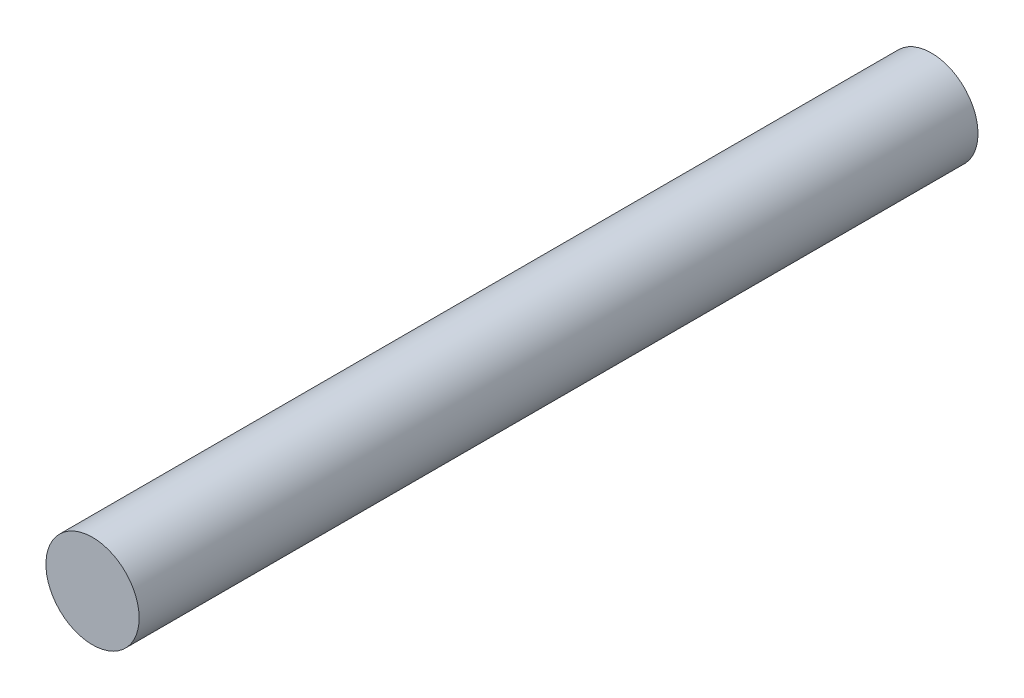
ISO-10303-21;
HEADER;
FILE_DESCRIPTION(('STEP AP214'),'2;1');
FILE_NAME('part.step','',(''),(''),'','','');
FILE_SCHEMA(('AUTOMOTIVE_DESIGN { 1 0 10303 214 1 1 1 1 }'));
ENDSEC;
DATA;
#1=APPLICATION_CONTEXT('core data for automotive mechanical design processes');
#2=APPLICATION_PROTOCOL_DEFINITION('international standard','automotive_design',2000,#1);
#3=PRODUCT_CONTEXT('',#1,'mechanical');
#4=PRODUCT('Part','Part','',(#3));
#5=PRODUCT_RELATED_PRODUCT_CATEGORY('part','',(#4));
#6=PRODUCT_DEFINITION_FORMATION('','',#4);
#7=PRODUCT_DEFINITION_CONTEXT('part definition',#1,'design');
#8=PRODUCT_DEFINITION('design','',#6,#7);
#9=PRODUCT_DEFINITION_SHAPE('','',#8);
#10=(LENGTH_UNIT() NAMED_UNIT(*) SI_UNIT(.MILLI.,.METRE.));
#11=(NAMED_UNIT(*) PLANE_ANGLE_UNIT() SI_UNIT($,.RADIAN.));
#12=(NAMED_UNIT(*) SI_UNIT($,.STERADIAN.) SOLID_ANGLE_UNIT());
#13=UNCERTAINTY_MEASURE_WITH_UNIT(LENGTH_MEASURE(1.E-05),#10,'distance_accuracy_value','');
#14=(GEOMETRIC_REPRESENTATION_CONTEXT(3) GLOBAL_UNCERTAINTY_ASSIGNED_CONTEXT((#13)) GLOBAL_UNIT_ASSIGNED_CONTEXT((#10,
#11,#12)) REPRESENTATION_CONTEXT('',''));
#15=CARTESIAN_POINT('',(0.,0.,0.));
#16=DIRECTION('',(0.,0.,1.));
#17=DIRECTION('',(1.,0.,0.));
#18=AXIS2_PLACEMENT_3D('',#15,#16,#17);
#19=CARTESIAN_POINT('',(0.,0.,53.1));
#20=DIRECTION('',(0.,0.,-1.));
#21=DIRECTION('',(-1.,0.,0.));
#22=AXIS2_PLACEMENT_3D('',#19,#20,#21);
#23=CYLINDRICAL_SURFACE('',#22,2.95);
#24=CARTESIAN_POINT('',(0.,0.,53.1));
#25=DIRECTION('',(0.,0.,1.));
#26=DIRECTION('',(1.,0.,0.));
#27=AXIS2_PLACEMENT_3D('',#24,#25,#26);
#28=CIRCLE('',#27,2.95);
#29=CARTESIAN_POINT('',(2.95,0.,53.1));
#30=VERTEX_POINT('',#29);
#31=EDGE_CURVE('E10',#30,#30,#28,.T.);
#32=ORIENTED_EDGE('',*,*,#31,.F.);
#33=EDGE_LOOP('',(#32));
#34=FACE_BOUND('',#33,.T.);
#35=CARTESIAN_POINT('',(0.,0.,0.));
#36=DIRECTION('',(0.,0.,1.));
#37=DIRECTION('',(1.,0.,0.));
#38=AXIS2_PLACEMENT_3D('',#35,#36,#37);
#39=CIRCLE('',#38,2.95);
#40=CARTESIAN_POINT('',(2.95,0.,0.));
#41=VERTEX_POINT('',#40);
#42=EDGE_CURVE('E33',#41,#41,#39,.T.);
#43=ORIENTED_EDGE('',*,*,#42,.T.);
#44=EDGE_LOOP('',(#43));
#45=FACE_BOUND('',#44,.T.);
#46=ADVANCED_FACE('F30',(#34,#45),#23,.T.);
#47=CARTESIAN_POINT('',(0.,0.,53.1));
#48=DIRECTION('',(0.,0.,1.));
#49=DIRECTION('',(1.,0.,0.));
#50=AXIS2_PLACEMENT_3D('',#47,#48,#49);
#51=PLANE('',#50);
#52=ORIENTED_EDGE('',*,*,#31,.T.);
#53=EDGE_LOOP('',(#52));
#54=FACE_BOUND('',#53,.T.);
#55=ADVANCED_FACE('F45',(#54),#51,.T.);
#56=CARTESIAN_POINT('',(0.,0.,0.));
#57=DIRECTION('',(0.,0.,1.));
#58=DIRECTION('',(1.,0.,0.));
#59=AXIS2_PLACEMENT_3D('',#56,#57,#58);
#60=PLANE('',#59);
#61=ORIENTED_EDGE('',*,*,#42,.F.);
#62=EDGE_LOOP('',(#61));
#63=FACE_BOUND('',#62,.T.);
#64=ADVANCED_FACE('F43',(#63),#60,.F.);
#65=CLOSED_SHELL('',(#46,#55,#64));
#66=MANIFOLD_SOLID_BREP('B2',#65);
#67=ADVANCED_BREP_SHAPE_REPRESENTATION('',(#18,#66),#14);
#68=SHAPE_DEFINITION_REPRESENTATION(#9,#67);
ENDSEC;
END-ISO-10303-21;
